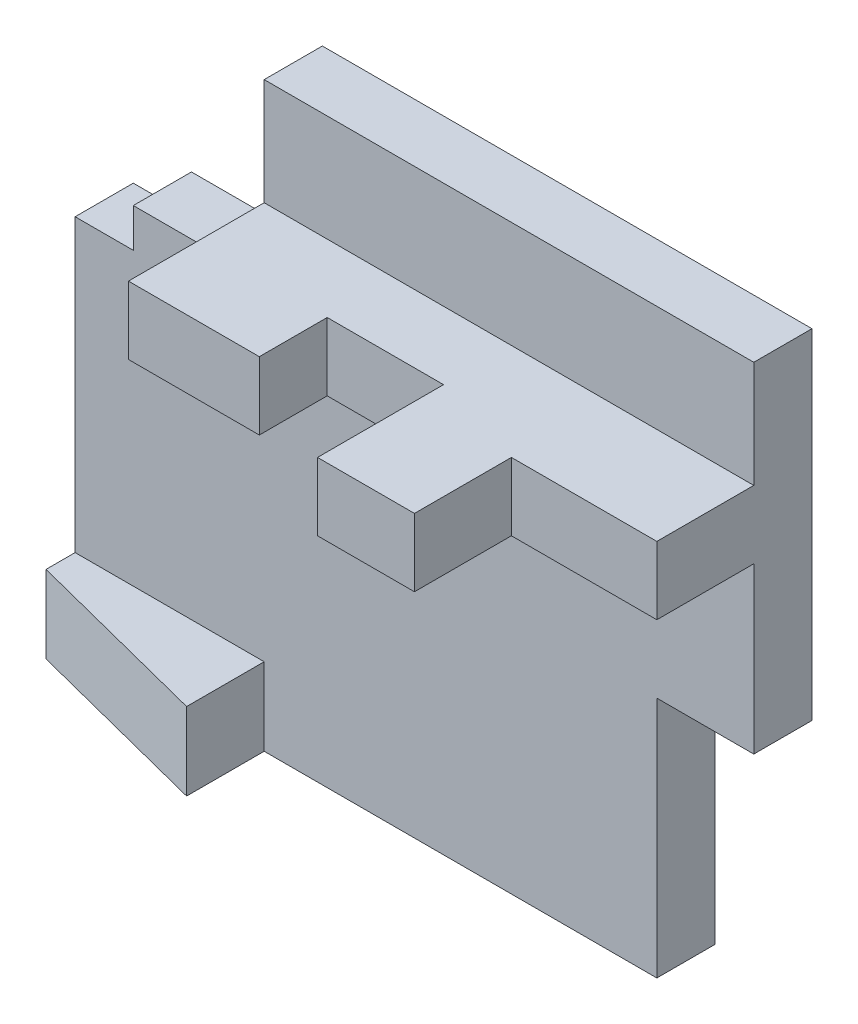
ISO-10303-21;
HEADER;
FILE_DESCRIPTION(('STEP AP214'),'2;1');
FILE_NAME('part.step','',(''),(''),'','','');
FILE_SCHEMA(('AUTOMOTIVE_DESIGN { 1 0 10303 214 1 1 1 1 }'));
ENDSEC;
DATA;
#1=APPLICATION_CONTEXT('core data for automotive mechanical design processes');
#2=APPLICATION_PROTOCOL_DEFINITION('international standard','automotive_design',2000,#1);
#3=PRODUCT_CONTEXT('',#1,'mechanical');
#4=PRODUCT('Part','Part','',(#3));
#5=PRODUCT_RELATED_PRODUCT_CATEGORY('part','',(#4));
#6=PRODUCT_DEFINITION_FORMATION('','',#4);
#7=PRODUCT_DEFINITION_CONTEXT('part definition',#1,'design');
#8=PRODUCT_DEFINITION('design','',#6,#7);
#9=PRODUCT_DEFINITION_SHAPE('','',#8);
#10=(LENGTH_UNIT() NAMED_UNIT(*) SI_UNIT(.MILLI.,.METRE.));
#11=(NAMED_UNIT(*) PLANE_ANGLE_UNIT() SI_UNIT($,.RADIAN.));
#12=(NAMED_UNIT(*) SI_UNIT($,.STERADIAN.) SOLID_ANGLE_UNIT());
#13=UNCERTAINTY_MEASURE_WITH_UNIT(LENGTH_MEASURE(1.E-05),#10,'distance_accuracy_value','');
#14=(GEOMETRIC_REPRESENTATION_CONTEXT(3) GLOBAL_UNCERTAINTY_ASSIGNED_CONTEXT((#13)) GLOBAL_UNIT_ASSIGNED_CONTEXT((#10,
#11,#12)) REPRESENTATION_CONTEXT('',''));
#15=CARTESIAN_POINT('',(0.,0.,0.));
#16=DIRECTION('',(0.,0.,1.));
#17=DIRECTION('',(1.,0.,0.));
#18=AXIS2_PLACEMENT_3D('',#15,#16,#17);
#19=CARTESIAN_POINT('',(35.,19.,26.));
#20=DIRECTION('',(0.,-1.,0.));
#21=DIRECTION('',(1.,0.,0.));
#22=AXIS2_PLACEMENT_3D('',#19,#20,#21);
#23=PLANE('',#22);
#24=DIRECTION('',(0.,0.,-1.));
#25=VECTOR('',#24,1.);
#26=CARTESIAN_POINT('',(20.,19.,26.));
#27=LINE('',#26,#25);
#28=CARTESIAN_POINT('',(20.,19.,26.));
#29=VERTEX_POINT('',#28);
#30=CARTESIAN_POINT('',(20.,19.,16.));
#31=VERTEX_POINT('',#30);
#32=EDGE_CURVE('E53',#29,#31,#27,.T.);
#33=ORIENTED_EDGE('',*,*,#32,.T.);
#34=DIRECTION('',(-1.,0.,0.));
#35=VECTOR('',#34,1.);
#36=CARTESIAN_POINT('',(35.,19.,16.));
#37=LINE('',#36,#35);
#38=CARTESIAN_POINT('',(35.,19.,16.));
#39=VERTEX_POINT('',#38);
#40=EDGE_CURVE('E761',#39,#31,#37,.T.);
#41=ORIENTED_EDGE('',*,*,#40,.F.);
#42=DIRECTION('',(0.,0.,-1.));
#43=VECTOR('',#42,1.);
#44=CARTESIAN_POINT('',(35.,19.,26.));
#45=LINE('',#44,#43);
#46=CARTESIAN_POINT('',(35.,19.,6.));
#47=VERTEX_POINT('',#46);
#48=EDGE_CURVE('E251',#39,#47,#45,.T.);
#49=ORIENTED_EDGE('',*,*,#48,.T.);
#50=DIRECTION('',(-1.,0.,0.));
#51=VECTOR('',#50,1.);
#52=CARTESIAN_POINT('',(35.,19.,6.));
#53=LINE('',#52,#51);
#54=CARTESIAN_POINT('',(-15.5,19.,6.));
#55=VERTEX_POINT('',#54);
#56=EDGE_CURVE('E242',#47,#55,#53,.T.);
#57=ORIENTED_EDGE('',*,*,#56,.T.);
#58=DIRECTION('',(0.,0.,-1.));
#59=VECTOR('',#58,1.);
#60=CARTESIAN_POINT('',(-15.5,19.,26.));
#61=LINE('',#60,#59);
#62=CARTESIAN_POINT('',(-15.5,19.,20.));
#63=VERTEX_POINT('',#62);
#64=EDGE_CURVE('E249',#63,#55,#61,.T.);
#65=ORIENTED_EDGE('',*,*,#64,.F.);
#66=DIRECTION('',(1.,0.,0.));
#67=VECTOR('',#66,1.);
#68=CARTESIAN_POINT('',(0.,19.,20.));
#69=LINE('',#68,#67);
#70=CARTESIAN_POINT('',(-2.,19.,20.));
#71=VERTEX_POINT('',#70);
#72=EDGE_CURVE('E749',#63,#71,#69,.T.);
#73=ORIENTED_EDGE('',*,*,#72,.T.);
#74=DIRECTION('',(0.,0.,-1.));
#75=VECTOR('',#74,1.);
#76=CARTESIAN_POINT('',(-2.,19.,0.));
#77=LINE('',#76,#75);
#78=CARTESIAN_POINT('',(-2.,19.,13.));
#79=VERTEX_POINT('',#78);
#80=EDGE_CURVE('E752',#71,#79,#77,.T.);
#81=ORIENTED_EDGE('',*,*,#80,.T.);
#82=DIRECTION('',(-1.,0.,0.));
#83=VECTOR('',#82,1.);
#84=CARTESIAN_POINT('',(0.,19.,13.));
#85=LINE('',#84,#83);
#86=CARTESIAN_POINT('',(10.,19.,13.));
#87=VERTEX_POINT('',#86);
#88=EDGE_CURVE('E740',#87,#79,#85,.T.);
#89=ORIENTED_EDGE('',*,*,#88,.F.);
#90=DIRECTION('',(0.,0.,-1.));
#91=VECTOR('',#90,1.);
#92=CARTESIAN_POINT('',(10.,19.,0.));
#93=LINE('',#92,#91);
#94=CARTESIAN_POINT('',(10.,19.,26.));
#95=VERTEX_POINT('',#94);
#96=EDGE_CURVE('E746',#95,#87,#93,.T.);
#97=ORIENTED_EDGE('',*,*,#96,.F.);
#98=DIRECTION('',(-1.,0.,0.));
#99=VECTOR('',#98,1.);
#100=CARTESIAN_POINT('',(35.,19.,26.));
#101=LINE('',#100,#99);
#102=EDGE_CURVE('E234',#29,#95,#101,.T.);
#103=ORIENTED_EDGE('',*,*,#102,.F.);
#104=EDGE_LOOP('',(#33,#41,#49,#57,#65,#73,#81,#89,#97,#103));
#105=FACE_BOUND('',#104,.T.);
#106=ADVANCED_FACE('F36',(#105),#23,.F.);
#107=CARTESIAN_POINT('',(35.,12.,26.));
#108=DIRECTION('',(0.,1.,0.));
#109=DIRECTION('',(-1.,0.,0.));
#110=AXIS2_PLACEMENT_3D('',#107,#108,#109);
#111=PLANE('',#110);
#112=DIRECTION('',(0.,0.,1.));
#113=VECTOR('',#112,1.);
#114=CARTESIAN_POINT('',(20.,12.,26.));
#115=LINE('',#114,#113);
#116=CARTESIAN_POINT('',(20.,12.,16.));
#117=VERTEX_POINT('',#116);
#118=CARTESIAN_POINT('',(20.,12.,26.));
#119=VERTEX_POINT('',#118);
#120=EDGE_CURVE('E217',#117,#119,#115,.T.);
#121=ORIENTED_EDGE('',*,*,#120,.T.);
#122=DIRECTION('',(1.,0.,0.));
#123=VECTOR('',#122,1.);
#124=CARTESIAN_POINT('',(35.,12.,26.));
#125=LINE('',#124,#123);
#126=CARTESIAN_POINT('',(10.,12.,26.));
#127=VERTEX_POINT('',#126);
#128=EDGE_CURVE('E227',#127,#119,#125,.T.);
#129=ORIENTED_EDGE('',*,*,#128,.F.);
#130=DIRECTION('',(0.,0.,1.));
#131=VECTOR('',#130,1.);
#132=CARTESIAN_POINT('',(10.,12.,0.));
#133=LINE('',#132,#131);
#134=CARTESIAN_POINT('',(10.,12.,13.));
#135=VERTEX_POINT('',#134);
#136=EDGE_CURVE('E61',#135,#127,#133,.T.);
#137=ORIENTED_EDGE('',*,*,#136,.F.);
#138=DIRECTION('',(1.,0.,0.));
#139=VECTOR('',#138,1.);
#140=CARTESIAN_POINT('',(0.,12.,13.));
#141=LINE('',#140,#139);
#142=CARTESIAN_POINT('',(-2.,12.,13.));
#143=VERTEX_POINT('',#142);
#144=EDGE_CURVE('E756',#143,#135,#141,.T.);
#145=ORIENTED_EDGE('',*,*,#144,.F.);
#146=DIRECTION('',(0.,0.,1.));
#147=VECTOR('',#146,1.);
#148=CARTESIAN_POINT('',(-2.,12.,0.));
#149=LINE('',#148,#147);
#150=CARTESIAN_POINT('',(-1.99999999999999,12.,20.));
#151=VERTEX_POINT('',#150);
#152=EDGE_CURVE('E732',#143,#151,#149,.T.);
#153=ORIENTED_EDGE('',*,*,#152,.T.);
#154=DIRECTION('',(-1.,0.,0.));
#155=VECTOR('',#154,1.);
#156=CARTESIAN_POINT('',(0.,12.,20.));
#157=LINE('',#156,#155);
#158=CARTESIAN_POINT('',(-15.5,12.,20.));
#159=VERTEX_POINT('',#158);
#160=EDGE_CURVE('E245',#151,#159,#157,.T.);
#161=ORIENTED_EDGE('',*,*,#160,.T.);
#162=DIRECTION('',(0.,0.,-1.));
#163=VECTOR('',#162,1.);
#164=CARTESIAN_POINT('',(-15.5,12.,26.));
#165=LINE('',#164,#163);
#166=CARTESIAN_POINT('',(-15.5,12.,6.));
#167=VERTEX_POINT('',#166);
#168=EDGE_CURVE('E236',#159,#167,#165,.T.);
#169=ORIENTED_EDGE('',*,*,#168,.T.);
#170=DIRECTION('',(1.,0.,0.));
#171=VECTOR('',#170,1.);
#172=CARTESIAN_POINT('',(35.,12.,6.));
#173=LINE('',#172,#171);
#174=CARTESIAN_POINT('',(35.,12.,6.));
#175=VERTEX_POINT('',#174);
#176=EDGE_CURVE('E238',#167,#175,#173,.T.);
#177=ORIENTED_EDGE('',*,*,#176,.T.);
#178=DIRECTION('',(0.,0.,-1.));
#179=VECTOR('',#178,1.);
#180=CARTESIAN_POINT('',(35.,12.,26.));
#181=LINE('',#180,#179);
#182=CARTESIAN_POINT('',(35.,12.,16.));
#183=VERTEX_POINT('',#182);
#184=EDGE_CURVE('E233',#183,#175,#181,.T.);
#185=ORIENTED_EDGE('',*,*,#184,.F.);
#186=DIRECTION('',(1.,0.,0.));
#187=VECTOR('',#186,1.);
#188=CARTESIAN_POINT('',(35.,12.,16.));
#189=LINE('',#188,#187);
#190=EDGE_CURVE('E229',#117,#183,#189,.T.);
#191=ORIENTED_EDGE('',*,*,#190,.F.);
#192=EDGE_LOOP('',(#121,#129,#137,#145,#153,#161,#169,#177,#185,#191));
#193=FACE_BOUND('',#192,.T.);
#194=ADVANCED_FACE('F226',(#193),#111,.F.);
#195=CARTESIAN_POINT('',(0.,0.,26.));
#196=DIRECTION('',(0.,0.,-1.));
#197=DIRECTION('',(-1.,0.,0.));
#198=AXIS2_PLACEMENT_3D('',#195,#196,#197);
#199=PLANE('',#198);
#200=DIRECTION('',(0.,1.,0.));
#201=VECTOR('',#200,1.);
#202=CARTESIAN_POINT('',(20.,-30.00105,26.));
#203=LINE('',#202,#201);
#204=EDGE_CURVE('E214',#119,#29,#203,.T.);
#205=ORIENTED_EDGE('',*,*,#204,.T.);
#206=ORIENTED_EDGE('',*,*,#102,.T.);
#207=DIRECTION('',(0.,1.,0.));
#208=VECTOR('',#207,1.);
#209=CARTESIAN_POINT('',(10.,-30.00105,26.));
#210=LINE('',#209,#208);
#211=EDGE_CURVE('E232',#127,#95,#210,.T.);
#212=ORIENTED_EDGE('',*,*,#211,.F.);
#213=ORIENTED_EDGE('',*,*,#128,.T.);
#214=EDGE_LOOP('',(#205,#206,#212,#213));
#215=FACE_BOUND('',#214,.T.);
#216=ADVANCED_FACE('F231',(#215),#199,.F.);
#217=CARTESIAN_POINT('',(-15.5,0.,6.));
#218=DIRECTION('',(-1.,0.,0.));
#219=DIRECTION('',(0.,0.,1.));
#220=AXIS2_PLACEMENT_3D('',#217,#218,#219);
#221=PLANE('',#220);
#222=ORIENTED_EDGE('',*,*,#168,.F.);
#223=DIRECTION('',(0.,1.,0.));
#224=VECTOR('',#223,1.);
#225=CARTESIAN_POINT('',(-15.5,-30.00105,20.));
#226=LINE('',#225,#224);
#227=EDGE_CURVE('E728',#159,#63,#226,.T.);
#228=ORIENTED_EDGE('',*,*,#227,.T.);
#229=ORIENTED_EDGE('',*,*,#64,.T.);
#230=DIRECTION('',(0.,1.,0.));
#231=VECTOR('',#230,1.);
#232=CARTESIAN_POINT('',(-15.5,0.,6.));
#233=LINE('',#232,#231);
#234=CARTESIAN_POINT('',(-15.5,30.,6.));
#235=VERTEX_POINT('',#234);
#236=EDGE_CURVE('E420',#55,#235,#233,.T.);
#237=ORIENTED_EDGE('',*,*,#236,.T.);
#238=DIRECTION('',(0.,0.,-1.));
#239=VECTOR('',#238,1.);
#240=CARTESIAN_POINT('',(-15.5,30.,6.));
#241=LINE('',#240,#239);
#242=CARTESIAN_POINT('',(-15.5,30.,0.));
#243=VERTEX_POINT('',#242);
#244=EDGE_CURVE('E380',#235,#243,#241,.T.);
#245=ORIENTED_EDGE('',*,*,#244,.T.);
#246=DIRECTION('',(0.,1.,0.));
#247=VECTOR('',#246,1.);
#248=CARTESIAN_POINT('',(-15.5,0.,0.));
#249=LINE('',#248,#247);
#250=CARTESIAN_POINT('',(-15.5,12.,0.));
#251=VERTEX_POINT('',#250);
#252=EDGE_CURVE('E357',#251,#243,#249,.T.);
#253=ORIENTED_EDGE('',*,*,#252,.F.);
#254=DIRECTION('',(0.,0.,-1.));
#255=VECTOR('',#254,1.);
#256=CARTESIAN_POINT('',(-15.5,12.,6.));
#257=LINE('',#256,#255);
#258=EDGE_CURVE('E378',#167,#251,#257,.T.);
#259=ORIENTED_EDGE('',*,*,#258,.F.);
#260=EDGE_LOOP('',(#222,#228,#229,#237,#245,#253,#259));
#261=FACE_BOUND('',#260,.T.);
#262=ADVANCED_FACE('F576',(#261),#221,.T.);
#263=CARTESIAN_POINT('',(0.,0.,6.));
#264=DIRECTION('',(0.,0.,1.));
#265=DIRECTION('',(1.,0.,0.));
#266=AXIS2_PLACEMENT_3D('',#263,#264,#265);
#267=PLANE('',#266);
#268=ORIENTED_EDGE('',*,*,#236,.F.);
#269=ORIENTED_EDGE('',*,*,#56,.F.);
#270=DIRECTION('',(0.,1.,0.));
#271=VECTOR('',#270,1.);
#272=CARTESIAN_POINT('',(35.,0.,6.));
#273=LINE('',#272,#271);
#274=CARTESIAN_POINT('',(35.,30.,6.));
#275=VERTEX_POINT('',#274);
#276=EDGE_CURVE('E414',#47,#275,#273,.T.);
#277=ORIENTED_EDGE('',*,*,#276,.T.);
#278=DIRECTION('',(1.,0.,0.));
#279=VECTOR('',#278,1.);
#280=CARTESIAN_POINT('',(0.,30.,6.));
#281=LINE('',#280,#279);
#282=EDGE_CURVE('E413',#235,#275,#281,.T.);
#283=ORIENTED_EDGE('',*,*,#282,.F.);
#284=EDGE_LOOP('',(#268,#269,#277,#283));
#285=FACE_BOUND('',#284,.T.);
#286=ADVANCED_FACE('F583',(#285),#267,.T.);
#287=CARTESIAN_POINT('',(35.,-4.99999999999999,6.));
#288=VERTEX_POINT('',#287);
#289=EDGE_CURVE('E410',#288,#175,#273,.T.);
#290=ORIENTED_EDGE('',*,*,#289,.T.);
#291=ORIENTED_EDGE('',*,*,#176,.F.);
#292=DIRECTION('',(1.,0.,0.));
#293=VECTOR('',#292,1.);
#294=CARTESIAN_POINT('',(0.,12.,6.));
#295=LINE('',#294,#293);
#296=CARTESIAN_POINT('',(-29.,12.,6.));
#297=VERTEX_POINT('',#296);
#298=EDGE_CURVE('E422',#297,#167,#295,.T.);
#299=ORIENTED_EDGE('',*,*,#298,.F.);
#300=DIRECTION('',(0.,1.,0.));
#301=VECTOR('',#300,1.);
#302=CARTESIAN_POINT('',(-29.,0.,6.));
#303=LINE('',#302,#301);
#304=CARTESIAN_POINT('',(-29.,7.99999999999999,6.));
#305=VERTEX_POINT('',#304);
#306=EDGE_CURVE('E335',#305,#297,#303,.T.);
#307=ORIENTED_EDGE('',*,*,#306,.F.);
#308=DIRECTION('',(-1.,0.,0.));
#309=VECTOR('',#308,1.);
#310=CARTESIAN_POINT('',(0.,7.99999999999999,6.));
#311=LINE('',#310,#309);
#312=CARTESIAN_POINT('',(-35.,7.99999999999999,6.));
#313=VERTEX_POINT('',#312);
#314=EDGE_CURVE('E329',#305,#313,#311,.T.);
#315=ORIENTED_EDGE('',*,*,#314,.T.);
#316=DIRECTION('',(0.,1.,0.));
#317=VECTOR('',#316,1.);
#318=CARTESIAN_POINT('',(-35.,0.,6.));
#319=LINE('',#318,#317);
#320=CARTESIAN_POINT('',(-35.,-22.0000000000001,6.));
#321=VERTEX_POINT('',#320);
#322=EDGE_CURVE('E320',#321,#313,#319,.T.);
#323=ORIENTED_EDGE('',*,*,#322,.F.);
#324=DIRECTION('',(1.,0.,0.));
#325=VECTOR('',#324,1.);
#326=CARTESIAN_POINT('',(-15.5,-22.0000000000001,6.));
#327=LINE('',#326,#325);
#328=CARTESIAN_POINT('',(-15.5,-22.0000000000001,6.));
#329=VERTEX_POINT('',#328);
#330=EDGE_CURVE('E286',#321,#329,#327,.T.);
#331=ORIENTED_EDGE('',*,*,#330,.T.);
#332=DIRECTION('',(0.,-1.,0.));
#333=VECTOR('',#332,1.);
#334=CARTESIAN_POINT('',(-15.5,-22.0000000000001,6.));
#335=LINE('',#334,#333);
#336=CARTESIAN_POINT('',(-15.5,-30.,6.));
#337=VERTEX_POINT('',#336);
#338=EDGE_CURVE('E299',#329,#337,#335,.T.);
#339=ORIENTED_EDGE('',*,*,#338,.T.);
#340=DIRECTION('',(1.,0.,0.));
#341=VECTOR('',#340,1.);
#342=CARTESIAN_POINT('',(0.,-30.,6.));
#343=LINE('',#342,#341);
#344=CARTESIAN_POINT('',(25.,-30.,6.));
#345=VERTEX_POINT('',#344);
#346=EDGE_CURVE('E339',#337,#345,#343,.T.);
#347=ORIENTED_EDGE('',*,*,#346,.T.);
#348=DIRECTION('',(0.,1.,0.));
#349=VECTOR('',#348,1.);
#350=CARTESIAN_POINT('',(25.,0.,6.));
#351=LINE('',#350,#349);
#352=CARTESIAN_POINT('',(25.,-4.99999999999999,6.));
#353=VERTEX_POINT('',#352);
#354=EDGE_CURVE('E416',#345,#353,#351,.T.);
#355=ORIENTED_EDGE('',*,*,#354,.T.);
#356=DIRECTION('',(-1.,0.,0.));
#357=VECTOR('',#356,1.);
#358=CARTESIAN_POINT('',(0.,-4.99999999999999,6.));
#359=LINE('',#358,#357);
#360=EDGE_CURVE('E392',#288,#353,#359,.T.);
#361=ORIENTED_EDGE('',*,*,#360,.F.);
#362=EDGE_LOOP('',(#290,#291,#299,#307,#315,#323,#331,#339,#347,#355,#361));
#363=FACE_BOUND('',#362,.T.);
#364=ADVANCED_FACE('F326',(#363),#267,.T.);
#365=CARTESIAN_POINT('',(0.,-30.,6.));
#366=DIRECTION('',(0.,1.,0.));
#367=DIRECTION('',(-1.,0.,0.));
#368=AXIS2_PLACEMENT_3D('',#365,#366,#367);
#369=PLANE('',#368);
#370=DIRECTION('',(1.,0.,0.));
#371=VECTOR('',#370,1.);
#372=CARTESIAN_POINT('',(0.,-30.,0.));
#373=LINE('',#372,#371);
#374=CARTESIAN_POINT('',(-35.,-30.,0.));
#375=VERTEX_POINT('',#374);
#376=CARTESIAN_POINT('',(25.,-30.,0.));
#377=VERTEX_POINT('',#376);
#378=EDGE_CURVE('E296',#375,#377,#373,.T.);
#379=ORIENTED_EDGE('',*,*,#378,.T.);
#380=DIRECTION('',(0.,0.,-1.));
#381=VECTOR('',#380,1.);
#382=CARTESIAN_POINT('',(25.,-30.,6.));
#383=LINE('',#382,#381);
#384=EDGE_CURVE('E11',#345,#377,#383,.T.);
#385=ORIENTED_EDGE('',*,*,#384,.F.);
#386=ORIENTED_EDGE('',*,*,#346,.F.);
#387=DIRECTION('',(0.,0.,1.));
#388=VECTOR('',#387,1.);
#389=CARTESIAN_POINT('',(-15.5,-30.,14.));
#390=LINE('',#389,#388);
#391=CARTESIAN_POINT('',(-15.5,-30.,14.));
#392=VERTEX_POINT('',#391);
#393=EDGE_CURVE('E276',#337,#392,#390,.T.);
#394=ORIENTED_EDGE('',*,*,#393,.T.);
#395=DIRECTION('',(-0.968663866044045,0.,-0.248375350267704));
#396=VECTOR('',#395,1.);
#397=CARTESIAN_POINT('',(-35.,-30.,9.));
#398=LINE('',#397,#396);
#399=CARTESIAN_POINT('',(-35.,-30.,9.));
#400=VERTEX_POINT('',#399);
#401=EDGE_CURVE('E290',#392,#400,#398,.T.);
#402=ORIENTED_EDGE('',*,*,#401,.T.);
#403=DIRECTION('',(0.,0.,-1.));
#404=VECTOR('',#403,1.);
#405=CARTESIAN_POINT('',(-35.,-30.,6.));
#406=LINE('',#405,#404);
#407=EDGE_CURVE('E331',#400,#375,#406,.T.);
#408=ORIENTED_EDGE('',*,*,#407,.T.);
#409=EDGE_LOOP('',(#379,#385,#386,#394,#402,#408));
#410=FACE_BOUND('',#409,.T.);
#411=ADVANCED_FACE('F38',(#410),#369,.F.);
#412=CARTESIAN_POINT('',(25.,0.,6.));
#413=DIRECTION('',(-1.,0.,0.));
#414=DIRECTION('',(0.,0.,1.));
#415=AXIS2_PLACEMENT_3D('',#412,#413,#414);
#416=PLANE('',#415);
#417=DIRECTION('',(0.,1.,0.));
#418=VECTOR('',#417,1.);
#419=CARTESIAN_POINT('',(25.,0.,0.));
#420=LINE('',#419,#418);
#421=CARTESIAN_POINT('',(25.,-4.99999999999999,0.));
#422=VERTEX_POINT('',#421);
#423=EDGE_CURVE('E345',#377,#422,#420,.T.);
#424=ORIENTED_EDGE('',*,*,#423,.T.);
#425=DIRECTION('',(0.,0.,-1.));
#426=VECTOR('',#425,1.);
#427=CARTESIAN_POINT('',(25.,-4.99999999999999,6.));
#428=LINE('',#427,#426);
#429=EDGE_CURVE('E45',#353,#422,#428,.T.);
#430=ORIENTED_EDGE('',*,*,#429,.F.);
#431=ORIENTED_EDGE('',*,*,#354,.F.);
#432=ORIENTED_EDGE('',*,*,#384,.T.);
#433=EDGE_LOOP('',(#424,#430,#431,#432));
#434=FACE_BOUND('',#433,.T.);
#435=ADVANCED_FACE('F395',(#434),#416,.F.);
#436=CARTESIAN_POINT('',(0.,-4.99999999999999,6.));
#437=DIRECTION('',(0.,-1.,0.));
#438=DIRECTION('',(1.,0.,0.));
#439=AXIS2_PLACEMENT_3D('',#436,#437,#438);
#440=PLANE('',#439);
#441=DIRECTION('',(-1.,0.,0.));
#442=VECTOR('',#441,1.);
#443=CARTESIAN_POINT('',(0.,-4.99999999999999,0.));
#444=LINE('',#443,#442);
#445=CARTESIAN_POINT('',(35.,-4.99999999999999,0.));
#446=VERTEX_POINT('',#445);
#447=EDGE_CURVE('E348',#446,#422,#444,.T.);
#448=ORIENTED_EDGE('',*,*,#447,.F.);
#449=DIRECTION('',(0.,0.,-1.));
#450=VECTOR('',#449,1.);
#451=CARTESIAN_POINT('',(35.,-4.99999999999999,6.));
#452=LINE('',#451,#450);
#453=EDGE_CURVE('E384',#288,#446,#452,.T.);
#454=ORIENTED_EDGE('',*,*,#453,.F.);
#455=ORIENTED_EDGE('',*,*,#360,.T.);
#456=ORIENTED_EDGE('',*,*,#429,.T.);
#457=EDGE_LOOP('',(#448,#454,#455,#456));
#458=FACE_BOUND('',#457,.T.);
#459=ADVANCED_FACE('F390',(#458),#440,.T.);
#460=CARTESIAN_POINT('',(35.,0.,6.));
#461=DIRECTION('',(-1.,0.,0.));
#462=DIRECTION('',(0.,0.,1.));
#463=AXIS2_PLACEMENT_3D('',#460,#461,#462);
#464=PLANE('',#463);
#465=ORIENTED_EDGE('',*,*,#48,.F.);
#466=DIRECTION('',(0.,1.,0.));
#467=VECTOR('',#466,1.);
#468=CARTESIAN_POINT('',(35.,-30.00105,16.));
#469=LINE('',#468,#467);
#470=EDGE_CURVE('E764',#183,#39,#469,.T.);
#471=ORIENTED_EDGE('',*,*,#470,.F.);
#472=ORIENTED_EDGE('',*,*,#184,.T.);
#473=ORIENTED_EDGE('',*,*,#289,.F.);
#474=ORIENTED_EDGE('',*,*,#453,.T.);
#475=DIRECTION('',(0.,1.,0.));
#476=VECTOR('',#475,1.);
#477=CARTESIAN_POINT('',(35.,0.,0.));
#478=LINE('',#477,#476);
#479=CARTESIAN_POINT('',(35.,30.,0.));
#480=VERTEX_POINT('',#479);
#481=EDGE_CURVE('E351',#446,#480,#478,.T.);
#482=ORIENTED_EDGE('',*,*,#481,.T.);
#483=DIRECTION('',(0.,0.,-1.));
#484=VECTOR('',#483,1.);
#485=CARTESIAN_POINT('',(35.,30.,6.));
#486=LINE('',#485,#484);
#487=EDGE_CURVE('E382',#275,#480,#486,.T.);
#488=ORIENTED_EDGE('',*,*,#487,.F.);
#489=ORIENTED_EDGE('',*,*,#276,.F.);
#490=EDGE_LOOP('',(#465,#471,#472,#473,#474,#482,#488,#489));
#491=FACE_BOUND('',#490,.T.);
#492=ADVANCED_FACE('F406',(#491),#464,.F.);
#493=CARTESIAN_POINT('',(0.,30.,6.));
#494=DIRECTION('',(0.,1.,0.));
#495=DIRECTION('',(-1.,0.,0.));
#496=AXIS2_PLACEMENT_3D('',#493,#494,#495);
#497=PLANE('',#496);
#498=DIRECTION('',(1.,0.,0.));
#499=VECTOR('',#498,1.);
#500=CARTESIAN_POINT('',(0.,30.,0.));
#501=LINE('',#500,#499);
#502=EDGE_CURVE('E354',#243,#480,#501,.T.);
#503=ORIENTED_EDGE('',*,*,#502,.F.);
#504=ORIENTED_EDGE('',*,*,#244,.F.);
#505=ORIENTED_EDGE('',*,*,#282,.T.);
#506=ORIENTED_EDGE('',*,*,#487,.T.);
#507=EDGE_LOOP('',(#503,#504,#505,#506));
#508=FACE_BOUND('',#507,.T.);
#509=ADVANCED_FACE('F594',(#508),#497,.T.);
#510=CARTESIAN_POINT('',(0.,12.,6.));
#511=DIRECTION('',(0.,1.,0.));
#512=DIRECTION('',(0.,0.,1.));
#513=AXIS2_PLACEMENT_3D('',#510,#511,#512);
#514=PLANE('',#513);
#515=DIRECTION('',(1.,0.,0.));
#516=VECTOR('',#515,1.);
#517=CARTESIAN_POINT('',(0.,12.,0.));
#518=LINE('',#517,#516);
#519=CARTESIAN_POINT('',(-29.,12.,0.));
#520=VERTEX_POINT('',#519);
#521=EDGE_CURVE('E360',#520,#251,#518,.T.);
#522=ORIENTED_EDGE('',*,*,#521,.F.);
#523=DIRECTION('',(0.,0.,-1.));
#524=VECTOR('',#523,1.);
#525=CARTESIAN_POINT('',(-29.,12.,6.));
#526=LINE('',#525,#524);
#527=EDGE_CURVE('E376',#297,#520,#526,.T.);
#528=ORIENTED_EDGE('',*,*,#527,.F.);
#529=ORIENTED_EDGE('',*,*,#298,.T.);
#530=ORIENTED_EDGE('',*,*,#258,.T.);
#531=EDGE_LOOP('',(#522,#528,#529,#530));
#532=FACE_BOUND('',#531,.T.);
#533=ADVANCED_FACE('F432',(#532),#514,.T.);
#534=CARTESIAN_POINT('',(-29.,0.,6.));
#535=DIRECTION('',(-1.,0.,0.));
#536=DIRECTION('',(0.,0.,1.));
#537=AXIS2_PLACEMENT_3D('',#534,#535,#536);
#538=PLANE('',#537);
#539=DIRECTION('',(0.,1.,0.));
#540=VECTOR('',#539,1.);
#541=CARTESIAN_POINT('',(-29.,0.,0.));
#542=LINE('',#541,#540);
#543=CARTESIAN_POINT('',(-29.,7.99999999999999,0.));
#544=VERTEX_POINT('',#543);
#545=EDGE_CURVE('E363',#544,#520,#542,.T.);
#546=ORIENTED_EDGE('',*,*,#545,.F.);
#547=DIRECTION('',(0.,0.,-1.));
#548=VECTOR('',#547,1.);
#549=CARTESIAN_POINT('',(-29.,7.99999999999999,6.));
#550=LINE('',#549,#548);
#551=EDGE_CURVE('E374',#305,#544,#550,.T.);
#552=ORIENTED_EDGE('',*,*,#551,.F.);
#553=ORIENTED_EDGE('',*,*,#306,.T.);
#554=ORIENTED_EDGE('',*,*,#527,.T.);
#555=EDGE_LOOP('',(#546,#552,#553,#554));
#556=FACE_BOUND('',#555,.T.);
#557=ADVANCED_FACE('F427',(#556),#538,.T.);
#558=CARTESIAN_POINT('',(0.,7.99999999999999,6.));
#559=DIRECTION('',(0.,-1.,0.));
#560=DIRECTION('',(0.,0.,-1.));
#561=AXIS2_PLACEMENT_3D('',#558,#559,#560);
#562=PLANE('',#561);
#563=DIRECTION('',(-1.,0.,0.));
#564=VECTOR('',#563,1.);
#565=CARTESIAN_POINT('',(0.,7.99999999999999,0.));
#566=LINE('',#565,#564);
#567=CARTESIAN_POINT('',(-35.,7.99999999999999,0.));
#568=VERTEX_POINT('',#567);
#569=EDGE_CURVE('E366',#544,#568,#566,.T.);
#570=ORIENTED_EDGE('',*,*,#569,.T.);
#571=DIRECTION('',(0.,0.,-1.));
#572=VECTOR('',#571,1.);
#573=CARTESIAN_POINT('',(-35.,7.99999999999999,6.));
#574=LINE('',#573,#572);
#575=EDGE_CURVE('E333',#313,#568,#574,.T.);
#576=ORIENTED_EDGE('',*,*,#575,.F.);
#577=ORIENTED_EDGE('',*,*,#314,.F.);
#578=ORIENTED_EDGE('',*,*,#551,.T.);
#579=EDGE_LOOP('',(#570,#576,#577,#578));
#580=FACE_BOUND('',#579,.T.);
#581=ADVANCED_FACE('F437',(#580),#562,.F.);
#582=CARTESIAN_POINT('',(-35.,0.,6.));
#583=DIRECTION('',(-1.,0.,0.));
#584=DIRECTION('',(0.,0.,1.));
#585=AXIS2_PLACEMENT_3D('',#582,#583,#584);
#586=PLANE('',#585);
#587=DIRECTION('',(0.,0.,-1.));
#588=VECTOR('',#587,1.);
#589=CARTESIAN_POINT('',(-35.,0.999999999999999,0.));
#590=LINE('',#589,#588);
#591=CARTESIAN_POINT('',(-35.,0.999999999999999,3.));
#592=VERTEX_POINT('',#591);
#593=CARTESIAN_POINT('',(-35.,0.999999999999999,0.));
#594=VERTEX_POINT('',#593);
#595=EDGE_CURVE('E258',#592,#594,#590,.T.);
#596=ORIENTED_EDGE('',*,*,#595,.F.);
#597=DIRECTION('',(0.,1.,0.));
#598=VECTOR('',#597,1.);
#599=CARTESIAN_POINT('',(-35.,-13.,3.));
#600=LINE('',#599,#598);
#601=CARTESIAN_POINT('',(-35.,-13.,3.));
#602=VERTEX_POINT('',#601);
#603=EDGE_CURVE('E269',#602,#592,#600,.T.);
#604=ORIENTED_EDGE('',*,*,#603,.F.);
#605=DIRECTION('',(0.,0.,1.));
#606=VECTOR('',#605,1.);
#607=CARTESIAN_POINT('',(-35.,-13.,0.));
#608=LINE('',#607,#606);
#609=CARTESIAN_POINT('',(-35.,-13.,0.));
#610=VERTEX_POINT('',#609);
#611=EDGE_CURVE('E253',#610,#602,#608,.T.);
#612=ORIENTED_EDGE('',*,*,#611,.F.);
#613=DIRECTION('',(0.,1.,0.));
#614=VECTOR('',#613,1.);
#615=CARTESIAN_POINT('',(-35.,0.,0.));
#616=LINE('',#615,#614);
#617=EDGE_CURVE('E370',#375,#610,#616,.T.);
#618=ORIENTED_EDGE('',*,*,#617,.F.);
#619=ORIENTED_EDGE('',*,*,#407,.F.);
#620=DIRECTION('',(0.,-1.,0.));
#621=VECTOR('',#620,1.);
#622=CARTESIAN_POINT('',(-35.,-22.0000000000001,9.));
#623=LINE('',#622,#621);
#624=CARTESIAN_POINT('',(-35.,-22.0000000000001,9.));
#625=VERTEX_POINT('',#624);
#626=EDGE_CURVE('E293',#625,#400,#623,.T.);
#627=ORIENTED_EDGE('',*,*,#626,.F.);
#628=DIRECTION('',(0.,0.,-1.));
#629=VECTOR('',#628,1.);
#630=CARTESIAN_POINT('',(-35.,-22.0000000000001,6.));
#631=LINE('',#630,#629);
#632=EDGE_CURVE('E289',#625,#321,#631,.T.);
#633=ORIENTED_EDGE('',*,*,#632,.T.);
#634=ORIENTED_EDGE('',*,*,#322,.T.);
#635=ORIENTED_EDGE('',*,*,#575,.T.);
#636=EDGE_CURVE('E369',#594,#568,#616,.T.);
#637=ORIENTED_EDGE('',*,*,#636,.F.);
#638=EDGE_LOOP('',(#596,#604,#612,#618,#619,#627,#633,#634,#635,#637));
#639=FACE_BOUND('',#638,.T.);
#640=ADVANCED_FACE('F318',(#639),#586,.T.);
#641=CARTESIAN_POINT('',(0.,0.,0.));
#642=DIRECTION('',(0.,0.,1.));
#643=DIRECTION('',(1.,0.,0.));
#644=AXIS2_PLACEMENT_3D('',#641,#642,#643);
#645=PLANE('',#644);
#646=DIRECTION('',(0.,-1.,0.));
#647=VECTOR('',#646,1.);
#648=CARTESIAN_POINT('',(12.,-13.,0.));
#649=LINE('',#648,#647);
#650=CARTESIAN_POINT('',(12.,0.999999999999999,0.));
#651=VERTEX_POINT('',#650);
#652=CARTESIAN_POINT('',(12.,-13.,0.));
#653=VERTEX_POINT('',#652);
#654=EDGE_CURVE('E254',#651,#653,#649,.T.);
#655=ORIENTED_EDGE('',*,*,#654,.F.);
#656=DIRECTION('',(-1.,0.,0.));
#657=VECTOR('',#656,1.);
#658=CARTESIAN_POINT('',(12.,0.999999999999999,0.));
#659=LINE('',#658,#657);
#660=EDGE_CURVE('E273',#651,#594,#659,.T.);
#661=ORIENTED_EDGE('',*,*,#660,.T.);
#662=ORIENTED_EDGE('',*,*,#636,.T.);
#663=ORIENTED_EDGE('',*,*,#569,.F.);
#664=ORIENTED_EDGE('',*,*,#545,.T.);
#665=ORIENTED_EDGE('',*,*,#521,.T.);
#666=ORIENTED_EDGE('',*,*,#252,.T.);
#667=ORIENTED_EDGE('',*,*,#502,.T.);
#668=ORIENTED_EDGE('',*,*,#481,.F.);
#669=ORIENTED_EDGE('',*,*,#447,.T.);
#670=ORIENTED_EDGE('',*,*,#423,.F.);
#671=ORIENTED_EDGE('',*,*,#378,.F.);
#672=ORIENTED_EDGE('',*,*,#617,.T.);
#673=DIRECTION('',(-1.,0.,0.));
#674=VECTOR('',#673,1.);
#675=CARTESIAN_POINT('',(12.,-13.,0.));
#676=LINE('',#675,#674);
#677=EDGE_CURVE('E266',#653,#610,#676,.T.);
#678=ORIENTED_EDGE('',*,*,#677,.F.);
#679=EDGE_LOOP('',(#655,#661,#662,#663,#664,#665,#666,#667,#668,#669,#670,#671,#672,#678));
#680=FACE_BOUND('',#679,.T.);
#681=ADVANCED_FACE('F401',(#680),#645,.F.);
#682=CARTESIAN_POINT('',(-35.,-22.0000000000001,9.));
#683=DIRECTION('',(-0.248375350267704,0.,0.968663866044045));
#684=DIRECTION('',(0.968663866044045,0.,0.248375350267704));
#685=AXIS2_PLACEMENT_3D('',#682,#683,#684);
#686=PLANE('',#685);
#687=ORIENTED_EDGE('',*,*,#401,.F.);
#688=DIRECTION('',(0.,-1.,0.));
#689=VECTOR('',#688,1.);
#690=CARTESIAN_POINT('',(-15.5,-22.0000000000001,14.));
#691=LINE('',#690,#689);
#692=CARTESIAN_POINT('',(-15.5,-22.0000000000001,14.));
#693=VERTEX_POINT('',#692);
#694=EDGE_CURVE('E297',#693,#392,#691,.T.);
#695=ORIENTED_EDGE('',*,*,#694,.F.);
#696=DIRECTION('',(-0.968663866044045,0.,-0.248375350267704));
#697=VECTOR('',#696,1.);
#698=CARTESIAN_POINT('',(-35.,-22.0000000000001,9.));
#699=LINE('',#698,#697);
#700=EDGE_CURVE('E285',#693,#625,#699,.T.);
#701=ORIENTED_EDGE('',*,*,#700,.T.);
#702=ORIENTED_EDGE('',*,*,#626,.T.);
#703=EDGE_LOOP('',(#687,#695,#701,#702));
#704=FACE_BOUND('',#703,.T.);
#705=ADVANCED_FACE('F458',(#704),#686,.T.);
#706=CARTESIAN_POINT('',(-15.5,-22.0000000000001,14.));
#707=DIRECTION('',(1.,0.,0.));
#708=DIRECTION('',(0.,0.,-1.));
#709=AXIS2_PLACEMENT_3D('',#706,#707,#708);
#710=PLANE('',#709);
#711=ORIENTED_EDGE('',*,*,#393,.F.);
#712=ORIENTED_EDGE('',*,*,#338,.F.);
#713=DIRECTION('',(0.,0.,1.));
#714=VECTOR('',#713,1.);
#715=CARTESIAN_POINT('',(-15.5,-22.0000000000001,14.));
#716=LINE('',#715,#714);
#717=EDGE_CURVE('E282',#329,#693,#716,.T.);
#718=ORIENTED_EDGE('',*,*,#717,.T.);
#719=ORIENTED_EDGE('',*,*,#694,.T.);
#720=EDGE_LOOP('',(#711,#712,#718,#719));
#721=FACE_BOUND('',#720,.T.);
#722=ADVANCED_FACE('F462',(#721),#710,.T.);
#723=CARTESIAN_POINT('',(0.,-22.0000000000001,0.));
#724=DIRECTION('',(0.,1.,0.));
#725=DIRECTION('',(0.,0.,1.));
#726=AXIS2_PLACEMENT_3D('',#723,#724,#725);
#727=PLANE('',#726);
#728=ORIENTED_EDGE('',*,*,#330,.F.);
#729=ORIENTED_EDGE('',*,*,#632,.F.);
#730=ORIENTED_EDGE('',*,*,#700,.F.);
#731=ORIENTED_EDGE('',*,*,#717,.F.);
#732=EDGE_LOOP('',(#728,#729,#730,#731));
#733=FACE_BOUND('',#732,.T.);
#734=ADVANCED_FACE('F460',(#733),#727,.T.);
#735=CARTESIAN_POINT('',(12.,0.999999999999999,0.));
#736=DIRECTION('',(0.,1.,0.));
#737=DIRECTION('',(0.,0.,1.));
#738=AXIS2_PLACEMENT_3D('',#735,#736,#737);
#739=PLANE('',#738);
#740=ORIENTED_EDGE('',*,*,#595,.T.);
#741=ORIENTED_EDGE('',*,*,#660,.F.);
#742=DIRECTION('',(0.,0.,-1.));
#743=VECTOR('',#742,1.);
#744=CARTESIAN_POINT('',(12.,0.999999999999999,0.));
#745=LINE('',#744,#743);
#746=CARTESIAN_POINT('',(12.,0.999999999999999,3.));
#747=VERTEX_POINT('',#746);
#748=EDGE_CURVE('E264',#747,#651,#745,.T.);
#749=ORIENTED_EDGE('',*,*,#748,.F.);
#750=DIRECTION('',(-1.,0.,0.));
#751=VECTOR('',#750,1.);
#752=CARTESIAN_POINT('',(12.,0.999999999999999,3.));
#753=LINE('',#752,#751);
#754=EDGE_CURVE('E277',#747,#592,#753,.T.);
#755=ORIENTED_EDGE('',*,*,#754,.T.);
#756=EDGE_LOOP('',(#740,#741,#749,#755));
#757=FACE_BOUND('',#756,.T.);
#758=ADVANCED_FACE('F442',(#757),#739,.F.);
#759=CARTESIAN_POINT('',(12.,-13.,3.));
#760=DIRECTION('',(0.,0.,1.));
#761=DIRECTION('',(1.,0.,0.));
#762=AXIS2_PLACEMENT_3D('',#759,#760,#761);
#763=PLANE('',#762);
#764=ORIENTED_EDGE('',*,*,#603,.T.);
#765=ORIENTED_EDGE('',*,*,#754,.F.);
#766=DIRECTION('',(0.,1.,0.));
#767=VECTOR('',#766,1.);
#768=CARTESIAN_POINT('',(12.,-13.,3.));
#769=LINE('',#768,#767);
#770=CARTESIAN_POINT('',(12.,-13.,3.));
#771=VERTEX_POINT('',#770);
#772=EDGE_CURVE('E261',#771,#747,#769,.T.);
#773=ORIENTED_EDGE('',*,*,#772,.F.);
#774=DIRECTION('',(-1.,0.,0.));
#775=VECTOR('',#774,1.);
#776=CARTESIAN_POINT('',(12.,-13.,3.));
#777=LINE('',#776,#775);
#778=EDGE_CURVE('E279',#771,#602,#777,.T.);
#779=ORIENTED_EDGE('',*,*,#778,.T.);
#780=EDGE_LOOP('',(#764,#765,#773,#779));
#781=FACE_BOUND('',#780,.T.);
#782=ADVANCED_FACE('F449',(#781),#763,.F.);
#783=CARTESIAN_POINT('',(12.,-13.,0.));
#784=DIRECTION('',(0.,-1.,0.));
#785=DIRECTION('',(0.,0.,-1.));
#786=AXIS2_PLACEMENT_3D('',#783,#784,#785);
#787=PLANE('',#786);
#788=ORIENTED_EDGE('',*,*,#611,.T.);
#789=ORIENTED_EDGE('',*,*,#778,.F.);
#790=DIRECTION('',(0.,0.,1.));
#791=VECTOR('',#790,1.);
#792=CARTESIAN_POINT('',(12.,-13.,0.));
#793=LINE('',#792,#791);
#794=EDGE_CURVE('E257',#653,#771,#793,.T.);
#795=ORIENTED_EDGE('',*,*,#794,.F.);
#796=ORIENTED_EDGE('',*,*,#677,.T.);
#797=EDGE_LOOP('',(#788,#789,#795,#796));
#798=FACE_BOUND('',#797,.T.);
#799=ADVANCED_FACE('F451',(#798),#787,.F.);
#800=CARTESIAN_POINT('',(12.,0.,0.));
#801=DIRECTION('',(1.,0.,0.));
#802=DIRECTION('',(0.,0.,-1.));
#803=AXIS2_PLACEMENT_3D('',#800,#801,#802);
#804=PLANE('',#803);
#805=ORIENTED_EDGE('',*,*,#654,.T.);
#806=ORIENTED_EDGE('',*,*,#794,.T.);
#807=ORIENTED_EDGE('',*,*,#772,.T.);
#808=ORIENTED_EDGE('',*,*,#748,.T.);
#809=EDGE_LOOP('',(#805,#806,#807,#808));
#810=FACE_BOUND('',#809,.T.);
#811=ADVANCED_FACE('F446',(#810),#804,.F.);
#812=CARTESIAN_POINT('',(-1.99999999999999,-30.00105,0.));
#813=DIRECTION('',(1.,0.,0.));
#814=DIRECTION('',(0.,1.,0.));
#815=AXIS2_PLACEMENT_3D('',#812,#813,#814);
#816=PLANE('',#815);
#817=DIRECTION('',(0.,1.,0.));
#818=VECTOR('',#817,1.);
#819=CARTESIAN_POINT('',(-1.99999999999999,-30.00105,13.));
#820=LINE('',#819,#818);
#821=EDGE_CURVE('E734',#143,#79,#820,.T.);
#822=ORIENTED_EDGE('',*,*,#821,.T.);
#823=ORIENTED_EDGE('',*,*,#80,.F.);
#824=DIRECTION('',(0.,1.,0.));
#825=VECTOR('',#824,1.);
#826=CARTESIAN_POINT('',(-1.99999999999999,-30.00105,20.));
#827=LINE('',#826,#825);
#828=EDGE_CURVE('E738',#151,#71,#827,.T.);
#829=ORIENTED_EDGE('',*,*,#828,.F.);
#830=ORIENTED_EDGE('',*,*,#152,.F.);
#831=EDGE_LOOP('',(#822,#823,#829,#830));
#832=FACE_BOUND('',#831,.T.);
#833=ADVANCED_FACE('F483',(#832),#816,.T.);
#834=CARTESIAN_POINT('',(0.,-30.00105,13.));
#835=DIRECTION('',(0.,0.,-1.));
#836=DIRECTION('',(-1.,0.,0.));
#837=AXIS2_PLACEMENT_3D('',#834,#835,#836);
#838=PLANE('',#837);
#839=ORIENTED_EDGE('',*,*,#144,.T.);
#840=DIRECTION('',(0.,1.,0.));
#841=VECTOR('',#840,1.);
#842=CARTESIAN_POINT('',(10.,-30.00105,13.));
#843=LINE('',#842,#841);
#844=EDGE_CURVE('E735',#135,#87,#843,.T.);
#845=ORIENTED_EDGE('',*,*,#844,.T.);
#846=ORIENTED_EDGE('',*,*,#88,.T.);
#847=ORIENTED_EDGE('',*,*,#821,.F.);
#848=EDGE_LOOP('',(#839,#845,#846,#847));
#849=FACE_BOUND('',#848,.T.);
#850=ADVANCED_FACE('F504',(#849),#838,.F.);
#851=CARTESIAN_POINT('',(10.,-30.00105,0.));
#852=DIRECTION('',(1.,0.,0.));
#853=DIRECTION('',(0.,1.,0.));
#854=AXIS2_PLACEMENT_3D('',#851,#852,#853);
#855=PLANE('',#854);
#856=ORIENTED_EDGE('',*,*,#136,.T.);
#857=ORIENTED_EDGE('',*,*,#211,.T.);
#858=ORIENTED_EDGE('',*,*,#96,.T.);
#859=ORIENTED_EDGE('',*,*,#844,.F.);
#860=EDGE_LOOP('',(#856,#857,#858,#859));
#861=FACE_BOUND('',#860,.T.);
#862=ADVANCED_FACE('F513',(#861),#855,.F.);
#863=CARTESIAN_POINT('',(0.,-30.00105,20.));
#864=DIRECTION('',(0.,0.,1.));
#865=DIRECTION('',(1.,0.,0.));
#866=AXIS2_PLACEMENT_3D('',#863,#864,#865);
#867=PLANE('',#866);
#868=ORIENTED_EDGE('',*,*,#828,.T.);
#869=ORIENTED_EDGE('',*,*,#72,.F.);
#870=ORIENTED_EDGE('',*,*,#227,.F.);
#871=ORIENTED_EDGE('',*,*,#160,.F.);
#872=EDGE_LOOP('',(#868,#869,#870,#871));
#873=FACE_BOUND('',#872,.T.);
#874=ADVANCED_FACE('F521',(#873),#867,.T.);
#875=CARTESIAN_POINT('',(20.,-30.00105,26.));
#876=DIRECTION('',(1.,0.,0.));
#877=DIRECTION('',(0.,0.,-1.));
#878=AXIS2_PLACEMENT_3D('',#875,#876,#877);
#879=PLANE('',#878);
#880=DIRECTION('',(0.,1.,0.));
#881=VECTOR('',#880,1.);
#882=CARTESIAN_POINT('',(20.,-30.00105,16.));
#883=LINE('',#882,#881);
#884=EDGE_CURVE('E222',#117,#31,#883,.T.);
#885=ORIENTED_EDGE('',*,*,#884,.T.);
#886=ORIENTED_EDGE('',*,*,#32,.F.);
#887=ORIENTED_EDGE('',*,*,#204,.F.);
#888=ORIENTED_EDGE('',*,*,#120,.F.);
#889=EDGE_LOOP('',(#885,#886,#887,#888));
#890=FACE_BOUND('',#889,.T.);
#891=ADVANCED_FACE('F216',(#890),#879,.T.);
#892=CARTESIAN_POINT('',(35.,-30.00105,16.));
#893=DIRECTION('',(0.,0.,-1.));
#894=DIRECTION('',(-1.,0.,0.));
#895=AXIS2_PLACEMENT_3D('',#892,#893,#894);
#896=PLANE('',#895);
#897=ORIENTED_EDGE('',*,*,#190,.T.);
#898=ORIENTED_EDGE('',*,*,#470,.T.);
#899=ORIENTED_EDGE('',*,*,#40,.T.);
#900=ORIENTED_EDGE('',*,*,#884,.F.);
#901=EDGE_LOOP('',(#897,#898,#899,#900));
#902=FACE_BOUND('',#901,.T.);
#903=ADVANCED_FACE('F535',(#902),#896,.F.);
#904=CLOSED_SHELL('',(#106,#194,#216,#262,#286,#364,#411,#435,#459,#492,#509,#533,#557,#581,
#640,#681,#705,#722,#734,#758,#782,#799,#811,#833,#850,#862,#874,#891,#903));
#905=MANIFOLD_SOLID_BREP('B2',#904);
#906=ADVANCED_BREP_SHAPE_REPRESENTATION('',(#18,#905),#14);
#907=SHAPE_DEFINITION_REPRESENTATION(#9,#906);
ENDSEC;
END-ISO-10303-21;
